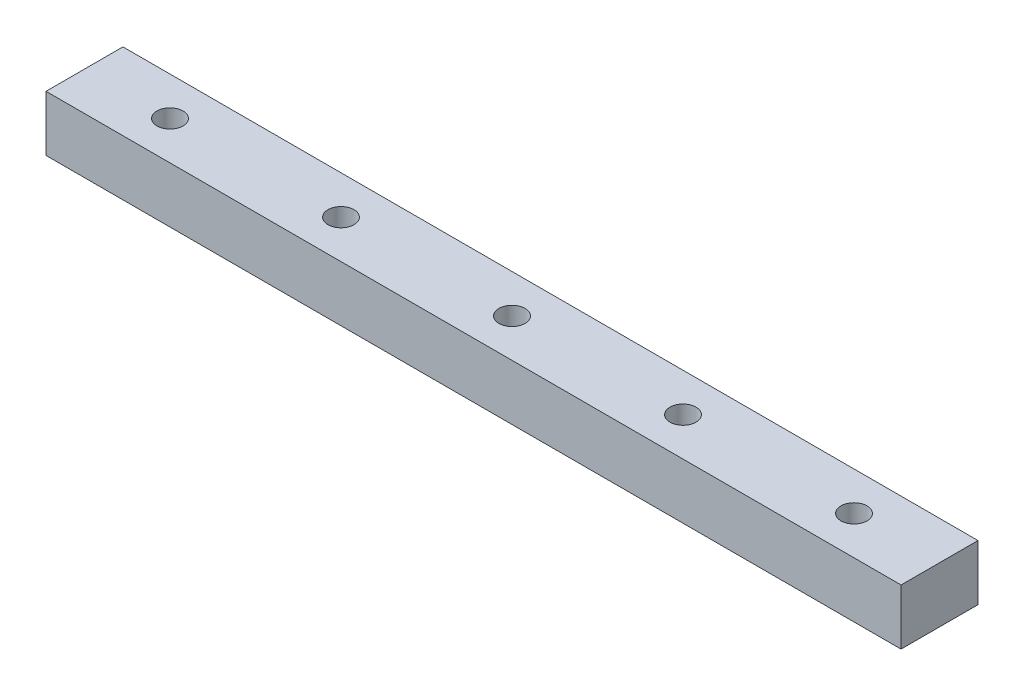
ISO-10303-21;
HEADER;
FILE_DESCRIPTION(('STEP AP214'),'2;1');
FILE_NAME('part.step','',(''),(''),'','','');
FILE_SCHEMA(('AUTOMOTIVE_DESIGN { 1 0 10303 214 1 1 1 1 }'));
ENDSEC;
DATA;
#1=APPLICATION_CONTEXT('core data for automotive mechanical design processes');
#2=APPLICATION_PROTOCOL_DEFINITION('international standard','automotive_design',2000,#1);
#3=PRODUCT_CONTEXT('',#1,'mechanical');
#4=PRODUCT('Part','Part','',(#3));
#5=PRODUCT_RELATED_PRODUCT_CATEGORY('part','',(#4));
#6=PRODUCT_DEFINITION_FORMATION('','',#4);
#7=PRODUCT_DEFINITION_CONTEXT('part definition',#1,'design');
#8=PRODUCT_DEFINITION('design','',#6,#7);
#9=PRODUCT_DEFINITION_SHAPE('','',#8);
#10=(LENGTH_UNIT() NAMED_UNIT(*) SI_UNIT(.MILLI.,.METRE.));
#11=(NAMED_UNIT(*) PLANE_ANGLE_UNIT() SI_UNIT($,.RADIAN.));
#12=(NAMED_UNIT(*) SI_UNIT($,.STERADIAN.) SOLID_ANGLE_UNIT());
#13=UNCERTAINTY_MEASURE_WITH_UNIT(LENGTH_MEASURE(1.E-05),#10,'distance_accuracy_value','');
#14=(GEOMETRIC_REPRESENTATION_CONTEXT(3) GLOBAL_UNCERTAINTY_ASSIGNED_CONTEXT((#13)) GLOBAL_UNIT_ASSIGNED_CONTEXT((#10,
#11,#12)) REPRESENTATION_CONTEXT('',''));
#15=CARTESIAN_POINT('',(0.,0.,0.));
#16=DIRECTION('',(0.,0.,1.));
#17=DIRECTION('',(1.,0.,0.));
#18=AXIS2_PLACEMENT_3D('',#15,#16,#17);
#19=CARTESIAN_POINT('',(100.,0.,0.));
#20=DIRECTION('',(0.,0.,-1.));
#21=DIRECTION('',(-1.,0.,0.));
#22=AXIS2_PLACEMENT_3D('',#19,#20,#21);
#23=PLANE('',#22);
#24=DIRECTION('',(0.,-1.,0.));
#25=VECTOR('',#24,1.);
#26=CARTESIAN_POINT('',(0.,0.,0.));
#27=LINE('',#26,#25);
#28=CARTESIAN_POINT('',(0.,6.5,0.));
#29=VERTEX_POINT('',#28);
#30=CARTESIAN_POINT('',(0.,0.,0.));
#31=VERTEX_POINT('',#30);
#32=EDGE_CURVE('E105',#29,#31,#27,.T.);
#33=ORIENTED_EDGE('',*,*,#32,.T.);
#34=DIRECTION('',(-1.,0.,0.));
#35=VECTOR('',#34,1.);
#36=CARTESIAN_POINT('',(100.,0.,0.));
#37=LINE('',#36,#35);
#38=CARTESIAN_POINT('',(100.,0.,0.));
#39=VERTEX_POINT('',#38);
#40=EDGE_CURVE('E11',#39,#31,#37,.T.);
#41=ORIENTED_EDGE('',*,*,#40,.F.);
#42=DIRECTION('',(0.,-1.,0.));
#43=VECTOR('',#42,1.);
#44=CARTESIAN_POINT('',(100.,0.,0.));
#45=LINE('',#44,#43);
#46=CARTESIAN_POINT('',(100.,6.5,0.));
#47=VERTEX_POINT('',#46);
#48=EDGE_CURVE('E89',#47,#39,#45,.T.);
#49=ORIENTED_EDGE('',*,*,#48,.F.);
#50=DIRECTION('',(-1.,0.,0.));
#51=VECTOR('',#50,1.);
#52=CARTESIAN_POINT('',(100.,6.5,0.));
#53=LINE('',#52,#51);
#54=EDGE_CURVE('E98',#47,#29,#53,.T.);
#55=ORIENTED_EDGE('',*,*,#54,.T.);
#56=EDGE_LOOP('',(#33,#41,#49,#55));
#57=FACE_BOUND('',#56,.T.);
#58=ADVANCED_FACE('F39',(#57),#23,.F.);
#59=CARTESIAN_POINT('',(100.,0.,0.));
#60=DIRECTION('',(0.,1.,0.));
#61=DIRECTION('',(0.,0.,1.));
#62=AXIS2_PLACEMENT_3D('',#59,#60,#61);
#63=PLANE('',#62);
#64=CARTESIAN_POINT('',(10.,0.,-4.5));
#65=DIRECTION('',(0.,1.,0.));
#66=DIRECTION('',(0.,0.,1.));
#67=AXIS2_PLACEMENT_3D('',#64,#65,#66);
#68=CIRCLE('',#67,1.525);
#69=CARTESIAN_POINT('',(10.,0.,-2.975));
#70=VERTEX_POINT('',#69);
#71=EDGE_CURVE('E104',#70,#70,#68,.T.);
#72=ORIENTED_EDGE('',*,*,#71,.T.);
#73=EDGE_LOOP('',(#72));
#74=FACE_BOUND('',#73,.T.);
#75=CARTESIAN_POINT('',(30.,0.,-4.5));
#76=DIRECTION('',(0.,1.,0.));
#77=DIRECTION('',(0.,0.,1.));
#78=AXIS2_PLACEMENT_3D('',#75,#76,#77);
#79=CIRCLE('',#78,1.525);
#80=CARTESIAN_POINT('',(30.,0.,-2.975));
#81=VERTEX_POINT('',#80);
#82=EDGE_CURVE('E140',#81,#81,#79,.T.);
#83=ORIENTED_EDGE('',*,*,#82,.T.);
#84=EDGE_LOOP('',(#83));
#85=FACE_BOUND('',#84,.T.);
#86=CARTESIAN_POINT('',(50.,0.,-4.5));
#87=DIRECTION('',(0.,1.,0.));
#88=DIRECTION('',(0.,0.,1.));
#89=AXIS2_PLACEMENT_3D('',#86,#87,#88);
#90=CIRCLE('',#89,1.525);
#91=CARTESIAN_POINT('',(50.,0.,-2.975));
#92=VERTEX_POINT('',#91);
#93=EDGE_CURVE('E133',#92,#92,#90,.T.);
#94=ORIENTED_EDGE('',*,*,#93,.T.);
#95=EDGE_LOOP('',(#94));
#96=FACE_BOUND('',#95,.T.);
#97=CARTESIAN_POINT('',(70.,0.,-4.5));
#98=DIRECTION('',(0.,1.,0.));
#99=DIRECTION('',(0.,0.,1.));
#100=AXIS2_PLACEMENT_3D('',#97,#98,#99);
#101=CIRCLE('',#100,1.52500000000001);
#102=CARTESIAN_POINT('',(70.,0.,-2.97499999999999));
#103=VERTEX_POINT('',#102);
#104=EDGE_CURVE('E124',#103,#103,#101,.T.);
#105=ORIENTED_EDGE('',*,*,#104,.T.);
#106=EDGE_LOOP('',(#105));
#107=FACE_BOUND('',#106,.T.);
#108=CARTESIAN_POINT('',(90.,0.,-4.5));
#109=DIRECTION('',(0.,1.,0.));
#110=DIRECTION('',(0.,0.,1.));
#111=AXIS2_PLACEMENT_3D('',#108,#109,#110);
#112=CIRCLE('',#111,1.52500000000001);
#113=CARTESIAN_POINT('',(90.,0.,-2.97499999999999));
#114=VERTEX_POINT('',#113);
#115=EDGE_CURVE('E120',#114,#114,#112,.T.);
#116=ORIENTED_EDGE('',*,*,#115,.T.);
#117=EDGE_LOOP('',(#116));
#118=FACE_BOUND('',#117,.T.);
#119=DIRECTION('',(0.,0.,-1.));
#120=VECTOR('',#119,1.);
#121=CARTESIAN_POINT('',(0.,0.,0.));
#122=LINE('',#121,#120);
#123=CARTESIAN_POINT('',(0.,0.,-9.));
#124=VERTEX_POINT('',#123);
#125=EDGE_CURVE('E94',#31,#124,#122,.T.);
#126=ORIENTED_EDGE('',*,*,#125,.T.);
#127=DIRECTION('',(-1.,0.,0.));
#128=VECTOR('',#127,1.);
#129=CARTESIAN_POINT('',(100.,0.,-9.));
#130=LINE('',#129,#128);
#131=CARTESIAN_POINT('',(100.,0.,-9.));
#132=VERTEX_POINT('',#131);
#133=EDGE_CURVE('E50',#132,#124,#130,.T.);
#134=ORIENTED_EDGE('',*,*,#133,.F.);
#135=DIRECTION('',(0.,0.,-1.));
#136=VECTOR('',#135,1.);
#137=CARTESIAN_POINT('',(100.,0.,0.));
#138=LINE('',#137,#136);
#139=EDGE_CURVE('E84',#39,#132,#138,.T.);
#140=ORIENTED_EDGE('',*,*,#139,.F.);
#141=ORIENTED_EDGE('',*,*,#40,.T.);
#142=EDGE_LOOP('',(#126,#134,#140,#141));
#143=FACE_BOUND('',#142,.T.);
#144=ADVANCED_FACE('F91',(#74,#85,#96,#107,#118,#143),#63,.F.);
#145=CARTESIAN_POINT('',(100.,0.,-9.));
#146=DIRECTION('',(0.,0.,1.));
#147=DIRECTION('',(1.,0.,0.));
#148=AXIS2_PLACEMENT_3D('',#145,#146,#147);
#149=PLANE('',#148);
#150=DIRECTION('',(0.,1.,0.));
#151=VECTOR('',#150,1.);
#152=CARTESIAN_POINT('',(0.,0.,-9.));
#153=LINE('',#152,#151);
#154=CARTESIAN_POINT('',(0.,6.5,-9.));
#155=VERTEX_POINT('',#154);
#156=EDGE_CURVE('E75',#124,#155,#153,.T.);
#157=ORIENTED_EDGE('',*,*,#156,.T.);
#158=DIRECTION('',(-1.,0.,0.));
#159=VECTOR('',#158,1.);
#160=CARTESIAN_POINT('',(100.,6.5,-9.));
#161=LINE('',#160,#159);
#162=CARTESIAN_POINT('',(100.,6.5,-9.));
#163=VERTEX_POINT('',#162);
#164=EDGE_CURVE('E92',#163,#155,#161,.T.);
#165=ORIENTED_EDGE('',*,*,#164,.F.);
#166=DIRECTION('',(0.,1.,0.));
#167=VECTOR('',#166,1.);
#168=CARTESIAN_POINT('',(100.,0.,-9.));
#169=LINE('',#168,#167);
#170=EDGE_CURVE('E86',#132,#163,#169,.T.);
#171=ORIENTED_EDGE('',*,*,#170,.F.);
#172=ORIENTED_EDGE('',*,*,#133,.T.);
#173=EDGE_LOOP('',(#157,#165,#171,#172));
#174=FACE_BOUND('',#173,.T.);
#175=ADVANCED_FACE('F96',(#174),#149,.F.);
#176=CARTESIAN_POINT('',(100.,6.5,0.));
#177=DIRECTION('',(0.,-1.,0.));
#178=DIRECTION('',(0.,0.,-1.));
#179=AXIS2_PLACEMENT_3D('',#176,#177,#178);
#180=PLANE('',#179);
#181=CARTESIAN_POINT('',(10.,6.5,-4.5));
#182=DIRECTION('',(0.,1.,0.));
#183=DIRECTION('',(0.,0.,1.));
#184=AXIS2_PLACEMENT_3D('',#181,#182,#183);
#185=CIRCLE('',#184,1.525);
#186=CARTESIAN_POINT('',(10.,6.5,-2.975));
#187=VERTEX_POINT('',#186);
#188=EDGE_CURVE('E139',#187,#187,#185,.T.);
#189=ORIENTED_EDGE('',*,*,#188,.F.);
#190=EDGE_LOOP('',(#189));
#191=FACE_BOUND('',#190,.T.);
#192=CARTESIAN_POINT('',(30.,6.5,-4.5));
#193=DIRECTION('',(0.,1.,0.));
#194=DIRECTION('',(0.,0.,1.));
#195=AXIS2_PLACEMENT_3D('',#192,#193,#194);
#196=CIRCLE('',#195,1.525);
#197=CARTESIAN_POINT('',(30.,6.5,-2.975));
#198=VERTEX_POINT('',#197);
#199=EDGE_CURVE('E135',#198,#198,#196,.T.);
#200=ORIENTED_EDGE('',*,*,#199,.F.);
#201=EDGE_LOOP('',(#200));
#202=FACE_BOUND('',#201,.T.);
#203=CARTESIAN_POINT('',(50.,6.5,-4.5));
#204=DIRECTION('',(0.,1.,0.));
#205=DIRECTION('',(0.,0.,1.));
#206=AXIS2_PLACEMENT_3D('',#203,#204,#205);
#207=CIRCLE('',#206,1.525);
#208=CARTESIAN_POINT('',(50.,6.5,-2.975));
#209=VERTEX_POINT('',#208);
#210=EDGE_CURVE('E126',#209,#209,#207,.T.);
#211=ORIENTED_EDGE('',*,*,#210,.F.);
#212=EDGE_LOOP('',(#211));
#213=FACE_BOUND('',#212,.T.);
#214=CARTESIAN_POINT('',(70.,6.5,-4.5));
#215=DIRECTION('',(0.,1.,0.));
#216=DIRECTION('',(0.,0.,1.));
#217=AXIS2_PLACEMENT_3D('',#214,#215,#216);
#218=CIRCLE('',#217,1.52500000000001);
#219=CARTESIAN_POINT('',(70.,6.5,-2.97499999999999));
#220=VERTEX_POINT('',#219);
#221=EDGE_CURVE('E125',#220,#220,#218,.T.);
#222=ORIENTED_EDGE('',*,*,#221,.F.);
#223=EDGE_LOOP('',(#222));
#224=FACE_BOUND('',#223,.T.);
#225=CARTESIAN_POINT('',(90.,6.5,-4.5));
#226=DIRECTION('',(0.,1.,0.));
#227=DIRECTION('',(0.,0.,1.));
#228=AXIS2_PLACEMENT_3D('',#225,#226,#227);
#229=CIRCLE('',#228,1.52500000000001);
#230=CARTESIAN_POINT('',(90.,6.5,-2.97499999999999));
#231=VERTEX_POINT('',#230);
#232=EDGE_CURVE('E118',#231,#231,#229,.T.);
#233=ORIENTED_EDGE('',*,*,#232,.F.);
#234=EDGE_LOOP('',(#233));
#235=FACE_BOUND('',#234,.T.);
#236=DIRECTION('',(0.,0.,1.));
#237=VECTOR('',#236,1.);
#238=CARTESIAN_POINT('',(0.,6.5,0.));
#239=LINE('',#238,#237);
#240=EDGE_CURVE('E77',#155,#29,#239,.T.);
#241=ORIENTED_EDGE('',*,*,#240,.T.);
#242=ORIENTED_EDGE('',*,*,#54,.F.);
#243=DIRECTION('',(0.,0.,1.));
#244=VECTOR('',#243,1.);
#245=CARTESIAN_POINT('',(100.,6.5,0.));
#246=LINE('',#245,#244);
#247=EDGE_CURVE('E54',#163,#47,#246,.T.);
#248=ORIENTED_EDGE('',*,*,#247,.F.);
#249=ORIENTED_EDGE('',*,*,#164,.T.);
#250=EDGE_LOOP('',(#241,#242,#248,#249));
#251=FACE_BOUND('',#250,.T.);
#252=ADVANCED_FACE('F109',(#191,#202,#213,#224,#235,#251),#180,.F.);
#253=CARTESIAN_POINT('',(100.,0.,0.));
#254=DIRECTION('',(-1.,0.,0.));
#255=DIRECTION('',(0.,0.,1.));
#256=AXIS2_PLACEMENT_3D('',#253,#254,#255);
#257=PLANE('',#256);
#258=ORIENTED_EDGE('',*,*,#48,.T.);
#259=ORIENTED_EDGE('',*,*,#139,.T.);
#260=ORIENTED_EDGE('',*,*,#170,.T.);
#261=ORIENTED_EDGE('',*,*,#247,.T.);
#262=EDGE_LOOP('',(#258,#259,#260,#261));
#263=FACE_BOUND('',#262,.T.);
#264=ADVANCED_FACE('F88',(#263),#257,.F.);
#265=CARTESIAN_POINT('',(0.,0.,0.));
#266=DIRECTION('',(-1.,0.,0.));
#267=DIRECTION('',(0.,0.,1.));
#268=AXIS2_PLACEMENT_3D('',#265,#266,#267);
#269=PLANE('',#268);
#270=ORIENTED_EDGE('',*,*,#32,.F.);
#271=ORIENTED_EDGE('',*,*,#240,.F.);
#272=ORIENTED_EDGE('',*,*,#156,.F.);
#273=ORIENTED_EDGE('',*,*,#125,.F.);
#274=EDGE_LOOP('',(#270,#271,#272,#273));
#275=FACE_BOUND('',#274,.T.);
#276=ADVANCED_FACE('F114',(#275),#269,.T.);
#277=CARTESIAN_POINT('',(90.,0.,-4.5));
#278=DIRECTION('',(0.,1.,0.));
#279=DIRECTION('',(0.,0.,1.));
#280=AXIS2_PLACEMENT_3D('',#277,#278,#279);
#281=CYLINDRICAL_SURFACE('',#280,1.52500000000001);
#282=CARTESIAN_POINT('',(90.,0.,-2.97499999999999));
#283=CARTESIAN_POINT('',(90.,0.0677083333333332,-2.97499999999999));
#284=CARTESIAN_POINT('',(90.,0.135416666666667,-2.97499999999999));
#285=CARTESIAN_POINT('',(90.,0.270833333333333,-2.97499999999999));
#286=CARTESIAN_POINT('',(90.,0.338541666666667,-2.97499999999999));
#287=CARTESIAN_POINT('',(90.,0.473958333333333,-2.97499999999999));
#288=CARTESIAN_POINT('',(90.,0.541666666666667,-2.97499999999999));
#289=CARTESIAN_POINT('',(90.,0.677083333333333,-2.97499999999999));
#290=CARTESIAN_POINT('',(90.,0.744791666666667,-2.97499999999999));
#291=CARTESIAN_POINT('',(90.,0.880208333333333,-2.97499999999999));
#292=CARTESIAN_POINT('',(90.,0.947916666666667,-2.97499999999999));
#293=CARTESIAN_POINT('',(90.,1.08333333333333,-2.97499999999999));
#294=CARTESIAN_POINT('',(90.,1.15104166666667,-2.97499999999999));
#295=CARTESIAN_POINT('',(90.,1.28645833333333,-2.97499999999999));
#296=CARTESIAN_POINT('',(90.,1.35416666666667,-2.97499999999999));
#297=CARTESIAN_POINT('',(90.,1.48958333333333,-2.97499999999999));
#298=CARTESIAN_POINT('',(90.,1.55729166666667,-2.97499999999999));
#299=CARTESIAN_POINT('',(90.,1.69270833333333,-2.97499999999999));
#300=CARTESIAN_POINT('',(90.,1.76041666666667,-2.97499999999999));
#301=CARTESIAN_POINT('',(90.,1.89583333333333,-2.97499999999999));
#302=CARTESIAN_POINT('',(90.,1.96354166666667,-2.97499999999999));
#303=CARTESIAN_POINT('',(90.,2.09895833333333,-2.97499999999999));
#304=CARTESIAN_POINT('',(90.,2.16666666666667,-2.97499999999999));
#305=CARTESIAN_POINT('',(90.,2.30208333333333,-2.97499999999999));
#306=CARTESIAN_POINT('',(90.,2.36979166666667,-2.97499999999999));
#307=CARTESIAN_POINT('',(90.,2.50520833333333,-2.97499999999999));
#308=CARTESIAN_POINT('',(90.,2.57291666666667,-2.97499999999999));
#309=CARTESIAN_POINT('',(90.,2.70833333333333,-2.97499999999999));
#310=CARTESIAN_POINT('',(90.,2.77604166666667,-2.97499999999999));
#311=CARTESIAN_POINT('',(90.,2.91145833333333,-2.97499999999999));
#312=CARTESIAN_POINT('',(90.,2.97916666666667,-2.97499999999999));
#313=CARTESIAN_POINT('',(90.,3.11458333333333,-2.97499999999999));
#314=CARTESIAN_POINT('',(90.,3.18229166666667,-2.97499999999999));
#315=CARTESIAN_POINT('',(90.,3.31770833333333,-2.97499999999999));
#316=CARTESIAN_POINT('',(90.,3.38541666666667,-2.97499999999999));
#317=CARTESIAN_POINT('',(90.,3.52083333333333,-2.97499999999999));
#318=CARTESIAN_POINT('',(90.,3.58854166666667,-2.97499999999999));
#319=CARTESIAN_POINT('',(90.,3.72395833333333,-2.97499999999999));
#320=CARTESIAN_POINT('',(90.,3.79166666666667,-2.97499999999999));
#321=CARTESIAN_POINT('',(90.,3.92708333333333,-2.97499999999999));
#322=CARTESIAN_POINT('',(90.,3.99479166666667,-2.97499999999999));
#323=CARTESIAN_POINT('',(90.,4.13020833333333,-2.97499999999999));
#324=CARTESIAN_POINT('',(90.,4.19791666666667,-2.97499999999999));
#325=CARTESIAN_POINT('',(90.,4.33333333333333,-2.97499999999999));
#326=CARTESIAN_POINT('',(90.,4.40104166666667,-2.97499999999999));
#327=CARTESIAN_POINT('',(90.,4.53645833333333,-2.97499999999999));
#328=CARTESIAN_POINT('',(90.,4.60416666666667,-2.97499999999999));
#329=CARTESIAN_POINT('',(90.,4.73958333333333,-2.97499999999999));
#330=CARTESIAN_POINT('',(90.,4.80729166666667,-2.97499999999999));
#331=CARTESIAN_POINT('',(90.,4.94270833333333,-2.97499999999999));
#332=CARTESIAN_POINT('',(90.,5.01041666666667,-2.97499999999999));
#333=CARTESIAN_POINT('',(90.,5.14583333333333,-2.97499999999999));
#334=CARTESIAN_POINT('',(90.,5.21354166666667,-2.97499999999999));
#335=CARTESIAN_POINT('',(90.,5.34895833333333,-2.97499999999999));
#336=CARTESIAN_POINT('',(90.,5.41666666666667,-2.97499999999999));
#337=CARTESIAN_POINT('',(90.,5.55208333333333,-2.97499999999999));
#338=CARTESIAN_POINT('',(90.,5.61979166666667,-2.97499999999999));
#339=CARTESIAN_POINT('',(90.,5.75520833333333,-2.97499999999999));
#340=CARTESIAN_POINT('',(90.,5.82291666666667,-2.97499999999999));
#341=CARTESIAN_POINT('',(90.,5.95833333333333,-2.97499999999999));
#342=CARTESIAN_POINT('',(90.,6.02604166666667,-2.97499999999999));
#343=CARTESIAN_POINT('',(90.,6.16145833333333,-2.97499999999999));
#344=CARTESIAN_POINT('',(90.,6.22916666666667,-2.97499999999999));
#345=CARTESIAN_POINT('',(90.,6.36458333333333,-2.97499999999999));
#346=CARTESIAN_POINT('',(90.,6.43229166666667,-2.97499999999999));
#347=CARTESIAN_POINT('',(90.,6.5,-2.97499999999999));
#348=B_SPLINE_CURVE_WITH_KNOTS('',3,(#282,#283,#284,#285,#286,#287,#288,#289,#290,#291,#292,
#293,#294,#295,#296,#297,#298,#299,#300,#301,#302,#303,#304,#305,#306,#307,#308,#309,#310,#311,
#312,#313,#314,#315,#316,#317,#318,#319,#320,#321,#322,#323,#324,#325,#326,#327,#328,#329,#330,
#331,#332,#333,#334,#335,#336,#337,#338,#339,#340,#341,#342,#343,#344,#345,#346,#347),
.UNSPECIFIED.,.F.,.F.,(4,2,2,2,2,2,2,2,2,2,2,2,2,2,2,2,2,2,2,2,2,2,2,2,2,2,2,2,2,2,2,2,4),(0.,
0.203125,0.40625,0.609375,0.8125,1.015625,1.21875,1.421875,1.625,1.828125,2.03125,2.234375,
2.4375,2.640625,2.84375,3.046875,3.25,3.453125,3.65625,3.859375,4.0625,4.265625,4.46875,
4.671875,4.875,5.078125,5.28125,5.484375,5.6875,5.890625,6.09375,6.296875,6.5),.UNSPECIFIED.);
#349=EDGE_CURVE('BSEAM167',#114,#231,#348,.T.);
#350=ORIENTED_EDGE('',*,*,#115,.F.);
#351=ORIENTED_EDGE('',*,*,#232,.T.);
#352=ORIENTED_EDGE('',*,*,#349,.T.);
#353=ORIENTED_EDGE('',*,*,#349,.F.);
#354=EDGE_LOOP('',(#350,#352,#351,#353));
#355=FACE_BOUND('',#354,.T.);
#356=ADVANCED_FACE('F167',(#355),#281,.F.);
#357=CARTESIAN_POINT('',(70.,0.,-4.5));
#358=DIRECTION('',(0.,1.,0.));
#359=DIRECTION('',(0.,0.,1.));
#360=AXIS2_PLACEMENT_3D('',#357,#358,#359);
#361=CYLINDRICAL_SURFACE('',#360,1.52500000000001);
#362=CARTESIAN_POINT('',(70.,0.,-2.97499999999999));
#363=CARTESIAN_POINT('',(70.,0.0677083333333332,-2.97499999999999));
#364=CARTESIAN_POINT('',(70.,0.135416666666667,-2.97499999999999));
#365=CARTESIAN_POINT('',(70.,0.270833333333333,-2.97499999999999));
#366=CARTESIAN_POINT('',(70.,0.338541666666667,-2.97499999999999));
#367=CARTESIAN_POINT('',(70.,0.473958333333333,-2.97499999999999));
#368=CARTESIAN_POINT('',(70.,0.541666666666667,-2.97499999999999));
#369=CARTESIAN_POINT('',(70.,0.677083333333333,-2.97499999999999));
#370=CARTESIAN_POINT('',(70.,0.744791666666667,-2.97499999999999));
#371=CARTESIAN_POINT('',(70.,0.880208333333333,-2.97499999999999));
#372=CARTESIAN_POINT('',(70.,0.947916666666667,-2.97499999999999));
#373=CARTESIAN_POINT('',(70.,1.08333333333333,-2.97499999999999));
#374=CARTESIAN_POINT('',(70.,1.15104166666667,-2.97499999999999));
#375=CARTESIAN_POINT('',(70.,1.28645833333333,-2.97499999999999));
#376=CARTESIAN_POINT('',(70.,1.35416666666667,-2.97499999999999));
#377=CARTESIAN_POINT('',(70.,1.48958333333333,-2.97499999999999));
#378=CARTESIAN_POINT('',(70.,1.55729166666667,-2.97499999999999));
#379=CARTESIAN_POINT('',(70.,1.69270833333333,-2.97499999999999));
#380=CARTESIAN_POINT('',(70.,1.76041666666667,-2.97499999999999));
#381=CARTESIAN_POINT('',(70.,1.89583333333333,-2.97499999999999));
#382=CARTESIAN_POINT('',(70.,1.96354166666667,-2.97499999999999));
#383=CARTESIAN_POINT('',(70.,2.09895833333333,-2.97499999999999));
#384=CARTESIAN_POINT('',(70.,2.16666666666667,-2.97499999999999));
#385=CARTESIAN_POINT('',(70.,2.30208333333333,-2.97499999999999));
#386=CARTESIAN_POINT('',(70.,2.36979166666667,-2.97499999999999));
#387=CARTESIAN_POINT('',(70.,2.50520833333333,-2.97499999999999));
#388=CARTESIAN_POINT('',(70.,2.57291666666667,-2.97499999999999));
#389=CARTESIAN_POINT('',(70.,2.70833333333333,-2.97499999999999));
#390=CARTESIAN_POINT('',(70.,2.77604166666667,-2.97499999999999));
#391=CARTESIAN_POINT('',(70.,2.91145833333333,-2.97499999999999));
#392=CARTESIAN_POINT('',(70.,2.97916666666667,-2.97499999999999));
#393=CARTESIAN_POINT('',(70.,3.11458333333333,-2.97499999999999));
#394=CARTESIAN_POINT('',(70.,3.18229166666667,-2.97499999999999));
#395=CARTESIAN_POINT('',(70.,3.31770833333333,-2.97499999999999));
#396=CARTESIAN_POINT('',(70.,3.38541666666667,-2.97499999999999));
#397=CARTESIAN_POINT('',(70.,3.52083333333333,-2.97499999999999));
#398=CARTESIAN_POINT('',(70.,3.58854166666667,-2.97499999999999));
#399=CARTESIAN_POINT('',(70.,3.72395833333333,-2.97499999999999));
#400=CARTESIAN_POINT('',(70.,3.79166666666667,-2.97499999999999));
#401=CARTESIAN_POINT('',(70.,3.92708333333333,-2.97499999999999));
#402=CARTESIAN_POINT('',(70.,3.99479166666667,-2.97499999999999));
#403=CARTESIAN_POINT('',(70.,4.13020833333333,-2.97499999999999));
#404=CARTESIAN_POINT('',(70.,4.19791666666667,-2.97499999999999));
#405=CARTESIAN_POINT('',(70.,4.33333333333333,-2.97499999999999));
#406=CARTESIAN_POINT('',(70.,4.40104166666667,-2.97499999999999));
#407=CARTESIAN_POINT('',(70.,4.53645833333333,-2.97499999999999));
#408=CARTESIAN_POINT('',(70.,4.60416666666667,-2.97499999999999));
#409=CARTESIAN_POINT('',(70.,4.73958333333333,-2.97499999999999));
#410=CARTESIAN_POINT('',(70.,4.80729166666667,-2.97499999999999));
#411=CARTESIAN_POINT('',(70.,4.94270833333333,-2.97499999999999));
#412=CARTESIAN_POINT('',(70.,5.01041666666667,-2.97499999999999));
#413=CARTESIAN_POINT('',(70.,5.14583333333333,-2.97499999999999));
#414=CARTESIAN_POINT('',(70.,5.21354166666667,-2.97499999999999));
#415=CARTESIAN_POINT('',(70.,5.34895833333333,-2.97499999999999));
#416=CARTESIAN_POINT('',(70.,5.41666666666667,-2.97499999999999));
#417=CARTESIAN_POINT('',(70.,5.55208333333333,-2.97499999999999));
#418=CARTESIAN_POINT('',(70.,5.61979166666667,-2.97499999999999));
#419=CARTESIAN_POINT('',(70.,5.75520833333333,-2.97499999999999));
#420=CARTESIAN_POINT('',(70.,5.82291666666667,-2.97499999999999));
#421=CARTESIAN_POINT('',(70.,5.95833333333333,-2.97499999999999));
#422=CARTESIAN_POINT('',(70.,6.02604166666667,-2.97499999999999));
#423=CARTESIAN_POINT('',(70.,6.16145833333333,-2.97499999999999));
#424=CARTESIAN_POINT('',(70.,6.22916666666667,-2.97499999999999));
#425=CARTESIAN_POINT('',(70.,6.36458333333333,-2.97499999999999));
#426=CARTESIAN_POINT('',(70.,6.43229166666667,-2.97499999999999));
#427=CARTESIAN_POINT('',(70.,6.5,-2.97499999999999));
#428=B_SPLINE_CURVE_WITH_KNOTS('',3,(#362,#363,#364,#365,#366,#367,#368,#369,#370,#371,#372,
#373,#374,#375,#376,#377,#378,#379,#380,#381,#382,#383,#384,#385,#386,#387,#388,#389,#390,#391,
#392,#393,#394,#395,#396,#397,#398,#399,#400,#401,#402,#403,#404,#405,#406,#407,#408,#409,#410,
#411,#412,#413,#414,#415,#416,#417,#418,#419,#420,#421,#422,#423,#424,#425,#426,#427),
.UNSPECIFIED.,.F.,.F.,(4,2,2,2,2,2,2,2,2,2,2,2,2,2,2,2,2,2,2,2,2,2,2,2,2,2,2,2,2,2,2,2,4),(0.,
0.203125,0.40625,0.609375,0.8125,1.015625,1.21875,1.421875,1.625,1.828125,2.03125,2.234375,
2.4375,2.640625,2.84375,3.046875,3.25,3.453125,3.65625,3.859375,4.0625,4.265625,4.46875,
4.671875,4.875,5.078125,5.28125,5.484375,5.6875,5.890625,6.09375,6.296875,6.5),.UNSPECIFIED.);
#429=EDGE_CURVE('BSEAM169',#103,#220,#428,.T.);
#430=ORIENTED_EDGE('',*,*,#104,.F.);
#431=ORIENTED_EDGE('',*,*,#221,.T.);
#432=ORIENTED_EDGE('',*,*,#429,.T.);
#433=ORIENTED_EDGE('',*,*,#429,.F.);
#434=EDGE_LOOP('',(#430,#432,#431,#433));
#435=FACE_BOUND('',#434,.T.);
#436=ADVANCED_FACE('F169',(#435),#361,.F.);
#437=CARTESIAN_POINT('',(50.,0.,-4.5));
#438=DIRECTION('',(0.,1.,0.));
#439=DIRECTION('',(0.,0.,1.));
#440=AXIS2_PLACEMENT_3D('',#437,#438,#439);
#441=CYLINDRICAL_SURFACE('',#440,1.525);
#442=CARTESIAN_POINT('',(50.,0.,-2.975));
#443=CARTESIAN_POINT('',(50.,0.0677083333333332,-2.975));
#444=CARTESIAN_POINT('',(50.,0.135416666666667,-2.975));
#445=CARTESIAN_POINT('',(50.,0.270833333333333,-2.975));
#446=CARTESIAN_POINT('',(50.,0.338541666666667,-2.975));
#447=CARTESIAN_POINT('',(50.,0.473958333333333,-2.975));
#448=CARTESIAN_POINT('',(50.,0.541666666666667,-2.975));
#449=CARTESIAN_POINT('',(50.,0.677083333333333,-2.975));
#450=CARTESIAN_POINT('',(50.,0.744791666666667,-2.975));
#451=CARTESIAN_POINT('',(50.,0.880208333333333,-2.975));
#452=CARTESIAN_POINT('',(50.,0.947916666666667,-2.975));
#453=CARTESIAN_POINT('',(50.,1.08333333333333,-2.975));
#454=CARTESIAN_POINT('',(50.,1.15104166666667,-2.975));
#455=CARTESIAN_POINT('',(50.,1.28645833333333,-2.975));
#456=CARTESIAN_POINT('',(50.,1.35416666666667,-2.975));
#457=CARTESIAN_POINT('',(50.,1.48958333333333,-2.975));
#458=CARTESIAN_POINT('',(50.,1.55729166666667,-2.975));
#459=CARTESIAN_POINT('',(50.,1.69270833333333,-2.975));
#460=CARTESIAN_POINT('',(50.,1.76041666666667,-2.975));
#461=CARTESIAN_POINT('',(50.,1.89583333333333,-2.975));
#462=CARTESIAN_POINT('',(50.,1.96354166666667,-2.975));
#463=CARTESIAN_POINT('',(50.,2.09895833333333,-2.975));
#464=CARTESIAN_POINT('',(50.,2.16666666666667,-2.975));
#465=CARTESIAN_POINT('',(50.,2.30208333333333,-2.975));
#466=CARTESIAN_POINT('',(50.,2.36979166666667,-2.975));
#467=CARTESIAN_POINT('',(50.,2.50520833333333,-2.975));
#468=CARTESIAN_POINT('',(50.,2.57291666666667,-2.975));
#469=CARTESIAN_POINT('',(50.,2.70833333333333,-2.975));
#470=CARTESIAN_POINT('',(50.,2.77604166666667,-2.975));
#471=CARTESIAN_POINT('',(50.,2.91145833333333,-2.975));
#472=CARTESIAN_POINT('',(50.,2.97916666666667,-2.975));
#473=CARTESIAN_POINT('',(50.,3.11458333333333,-2.975));
#474=CARTESIAN_POINT('',(50.,3.18229166666667,-2.975));
#475=CARTESIAN_POINT('',(50.,3.31770833333333,-2.975));
#476=CARTESIAN_POINT('',(50.,3.38541666666667,-2.975));
#477=CARTESIAN_POINT('',(50.,3.52083333333333,-2.975));
#478=CARTESIAN_POINT('',(50.,3.58854166666667,-2.975));
#479=CARTESIAN_POINT('',(50.,3.72395833333333,-2.975));
#480=CARTESIAN_POINT('',(50.,3.79166666666667,-2.975));
#481=CARTESIAN_POINT('',(50.,3.92708333333333,-2.975));
#482=CARTESIAN_POINT('',(50.,3.99479166666667,-2.975));
#483=CARTESIAN_POINT('',(50.,4.13020833333333,-2.975));
#484=CARTESIAN_POINT('',(50.,4.19791666666667,-2.975));
#485=CARTESIAN_POINT('',(50.,4.33333333333333,-2.975));
#486=CARTESIAN_POINT('',(50.,4.40104166666667,-2.975));
#487=CARTESIAN_POINT('',(50.,4.53645833333333,-2.975));
#488=CARTESIAN_POINT('',(50.,4.60416666666667,-2.975));
#489=CARTESIAN_POINT('',(50.,4.73958333333333,-2.975));
#490=CARTESIAN_POINT('',(50.,4.80729166666667,-2.975));
#491=CARTESIAN_POINT('',(50.,4.94270833333333,-2.975));
#492=CARTESIAN_POINT('',(50.,5.01041666666667,-2.975));
#493=CARTESIAN_POINT('',(50.,5.14583333333333,-2.975));
#494=CARTESIAN_POINT('',(50.,5.21354166666667,-2.975));
#495=CARTESIAN_POINT('',(50.,5.34895833333333,-2.975));
#496=CARTESIAN_POINT('',(50.,5.41666666666667,-2.975));
#497=CARTESIAN_POINT('',(50.,5.55208333333333,-2.975));
#498=CARTESIAN_POINT('',(50.,5.61979166666667,-2.975));
#499=CARTESIAN_POINT('',(50.,5.75520833333333,-2.975));
#500=CARTESIAN_POINT('',(50.,5.82291666666667,-2.975));
#501=CARTESIAN_POINT('',(50.,5.95833333333333,-2.975));
#502=CARTESIAN_POINT('',(50.,6.02604166666667,-2.975));
#503=CARTESIAN_POINT('',(50.,6.16145833333333,-2.975));
#504=CARTESIAN_POINT('',(50.,6.22916666666667,-2.975));
#505=CARTESIAN_POINT('',(50.,6.36458333333333,-2.975));
#506=CARTESIAN_POINT('',(50.,6.43229166666667,-2.975));
#507=CARTESIAN_POINT('',(50.,6.5,-2.975));
#508=B_SPLINE_CURVE_WITH_KNOTS('',3,(#442,#443,#444,#445,#446,#447,#448,#449,#450,#451,#452,
#453,#454,#455,#456,#457,#458,#459,#460,#461,#462,#463,#464,#465,#466,#467,#468,#469,#470,#471,
#472,#473,#474,#475,#476,#477,#478,#479,#480,#481,#482,#483,#484,#485,#486,#487,#488,#489,#490,
#491,#492,#493,#494,#495,#496,#497,#498,#499,#500,#501,#502,#503,#504,#505,#506,#507),
.UNSPECIFIED.,.F.,.F.,(4,2,2,2,2,2,2,2,2,2,2,2,2,2,2,2,2,2,2,2,2,2,2,2,2,2,2,2,2,2,2,2,4),(0.,
0.203125,0.40625,0.609375,0.8125,1.015625,1.21875,1.421875,1.625,1.828125,2.03125,2.234375,
2.4375,2.640625,2.84375,3.046875,3.25,3.453125,3.65625,3.859375,4.0625,4.265625,4.46875,
4.671875,4.875,5.078125,5.28125,5.484375,5.6875,5.890625,6.09375,6.296875,6.5),.UNSPECIFIED.);
#509=EDGE_CURVE('BSEAM175',#92,#209,#508,.T.);
#510=ORIENTED_EDGE('',*,*,#93,.F.);
#511=ORIENTED_EDGE('',*,*,#210,.T.);
#512=ORIENTED_EDGE('',*,*,#509,.T.);
#513=ORIENTED_EDGE('',*,*,#509,.F.);
#514=EDGE_LOOP('',(#510,#512,#511,#513));
#515=FACE_BOUND('',#514,.T.);
#516=ADVANCED_FACE('F175',(#515),#441,.F.);
#517=CARTESIAN_POINT('',(30.,0.,-4.5));
#518=DIRECTION('',(0.,1.,0.));
#519=DIRECTION('',(0.,0.,1.));
#520=AXIS2_PLACEMENT_3D('',#517,#518,#519);
#521=CYLINDRICAL_SURFACE('',#520,1.525);
#522=CARTESIAN_POINT('',(30.,0.,-2.975));
#523=CARTESIAN_POINT('',(30.,0.0677083333333332,-2.975));
#524=CARTESIAN_POINT('',(30.,0.135416666666667,-2.975));
#525=CARTESIAN_POINT('',(30.,0.270833333333333,-2.975));
#526=CARTESIAN_POINT('',(30.,0.338541666666667,-2.975));
#527=CARTESIAN_POINT('',(30.,0.473958333333333,-2.975));
#528=CARTESIAN_POINT('',(30.,0.541666666666667,-2.975));
#529=CARTESIAN_POINT('',(30.,0.677083333333333,-2.975));
#530=CARTESIAN_POINT('',(30.,0.744791666666667,-2.975));
#531=CARTESIAN_POINT('',(30.,0.880208333333333,-2.975));
#532=CARTESIAN_POINT('',(30.,0.947916666666667,-2.975));
#533=CARTESIAN_POINT('',(30.,1.08333333333333,-2.975));
#534=CARTESIAN_POINT('',(30.,1.15104166666667,-2.975));
#535=CARTESIAN_POINT('',(30.,1.28645833333333,-2.975));
#536=CARTESIAN_POINT('',(30.,1.35416666666667,-2.975));
#537=CARTESIAN_POINT('',(30.,1.48958333333333,-2.975));
#538=CARTESIAN_POINT('',(30.,1.55729166666667,-2.975));
#539=CARTESIAN_POINT('',(30.,1.69270833333333,-2.975));
#540=CARTESIAN_POINT('',(30.,1.76041666666667,-2.975));
#541=CARTESIAN_POINT('',(30.,1.89583333333333,-2.975));
#542=CARTESIAN_POINT('',(30.,1.96354166666667,-2.975));
#543=CARTESIAN_POINT('',(30.,2.09895833333333,-2.975));
#544=CARTESIAN_POINT('',(30.,2.16666666666667,-2.975));
#545=CARTESIAN_POINT('',(30.,2.30208333333333,-2.975));
#546=CARTESIAN_POINT('',(30.,2.36979166666667,-2.975));
#547=CARTESIAN_POINT('',(30.,2.50520833333333,-2.975));
#548=CARTESIAN_POINT('',(30.,2.57291666666667,-2.975));
#549=CARTESIAN_POINT('',(30.,2.70833333333333,-2.975));
#550=CARTESIAN_POINT('',(30.,2.77604166666667,-2.975));
#551=CARTESIAN_POINT('',(30.,2.91145833333333,-2.975));
#552=CARTESIAN_POINT('',(30.,2.97916666666667,-2.975));
#553=CARTESIAN_POINT('',(30.,3.11458333333333,-2.975));
#554=CARTESIAN_POINT('',(30.,3.18229166666667,-2.975));
#555=CARTESIAN_POINT('',(30.,3.31770833333333,-2.975));
#556=CARTESIAN_POINT('',(30.,3.38541666666667,-2.975));
#557=CARTESIAN_POINT('',(30.,3.52083333333333,-2.975));
#558=CARTESIAN_POINT('',(30.,3.58854166666667,-2.975));
#559=CARTESIAN_POINT('',(30.,3.72395833333333,-2.975));
#560=CARTESIAN_POINT('',(30.,3.79166666666667,-2.975));
#561=CARTESIAN_POINT('',(30.,3.92708333333333,-2.975));
#562=CARTESIAN_POINT('',(30.,3.99479166666667,-2.975));
#563=CARTESIAN_POINT('',(30.,4.13020833333333,-2.975));
#564=CARTESIAN_POINT('',(30.,4.19791666666667,-2.975));
#565=CARTESIAN_POINT('',(30.,4.33333333333333,-2.975));
#566=CARTESIAN_POINT('',(30.,4.40104166666667,-2.975));
#567=CARTESIAN_POINT('',(30.,4.53645833333333,-2.975));
#568=CARTESIAN_POINT('',(30.,4.60416666666667,-2.975));
#569=CARTESIAN_POINT('',(30.,4.73958333333333,-2.975));
#570=CARTESIAN_POINT('',(30.,4.80729166666667,-2.975));
#571=CARTESIAN_POINT('',(30.,4.94270833333333,-2.975));
#572=CARTESIAN_POINT('',(30.,5.01041666666667,-2.975));
#573=CARTESIAN_POINT('',(30.,5.14583333333333,-2.975));
#574=CARTESIAN_POINT('',(30.,5.21354166666667,-2.975));
#575=CARTESIAN_POINT('',(30.,5.34895833333333,-2.975));
#576=CARTESIAN_POINT('',(30.,5.41666666666667,-2.975));
#577=CARTESIAN_POINT('',(30.,5.55208333333333,-2.975));
#578=CARTESIAN_POINT('',(30.,5.61979166666667,-2.975));
#579=CARTESIAN_POINT('',(30.,5.75520833333333,-2.975));
#580=CARTESIAN_POINT('',(30.,5.82291666666667,-2.975));
#581=CARTESIAN_POINT('',(30.,5.95833333333333,-2.975));
#582=CARTESIAN_POINT('',(30.,6.02604166666667,-2.975));
#583=CARTESIAN_POINT('',(30.,6.16145833333333,-2.975));
#584=CARTESIAN_POINT('',(30.,6.22916666666667,-2.975));
#585=CARTESIAN_POINT('',(30.,6.36458333333333,-2.975));
#586=CARTESIAN_POINT('',(30.,6.43229166666667,-2.975));
#587=CARTESIAN_POINT('',(30.,6.5,-2.975));
#588=B_SPLINE_CURVE_WITH_KNOTS('',3,(#522,#523,#524,#525,#526,#527,#528,#529,#530,#531,#532,
#533,#534,#535,#536,#537,#538,#539,#540,#541,#542,#543,#544,#545,#546,#547,#548,#549,#550,#551,
#552,#553,#554,#555,#556,#557,#558,#559,#560,#561,#562,#563,#564,#565,#566,#567,#568,#569,#570,
#571,#572,#573,#574,#575,#576,#577,#578,#579,#580,#581,#582,#583,#584,#585,#586,#587),
.UNSPECIFIED.,.F.,.F.,(4,2,2,2,2,2,2,2,2,2,2,2,2,2,2,2,2,2,2,2,2,2,2,2,2,2,2,2,2,2,2,2,4),(0.,
0.203125,0.40625,0.609375,0.8125,1.015625,1.21875,1.421875,1.625,1.828125,2.03125,2.234375,
2.4375,2.640625,2.84375,3.046875,3.25,3.453125,3.65625,3.859375,4.0625,4.265625,4.46875,
4.671875,4.875,5.078125,5.28125,5.484375,5.6875,5.890625,6.09375,6.296875,6.5),.UNSPECIFIED.);
#589=EDGE_CURVE('BSEAM151',#81,#198,#588,.T.);
#590=ORIENTED_EDGE('',*,*,#82,.F.);
#591=ORIENTED_EDGE('',*,*,#199,.T.);
#592=ORIENTED_EDGE('',*,*,#589,.T.);
#593=ORIENTED_EDGE('',*,*,#589,.F.);
#594=EDGE_LOOP('',(#590,#592,#591,#593));
#595=FACE_BOUND('',#594,.T.);
#596=ADVANCED_FACE('F151',(#595),#521,.F.);
#597=CARTESIAN_POINT('',(10.,0.,-4.5));
#598=DIRECTION('',(0.,1.,0.));
#599=DIRECTION('',(0.,0.,1.));
#600=AXIS2_PLACEMENT_3D('',#597,#598,#599);
#601=CYLINDRICAL_SURFACE('',#600,1.525);
#602=CARTESIAN_POINT('',(10.,0.,-2.975));
#603=CARTESIAN_POINT('',(10.,0.0677083333333332,-2.975));
#604=CARTESIAN_POINT('',(10.,0.135416666666667,-2.975));
#605=CARTESIAN_POINT('',(10.,0.270833333333333,-2.975));
#606=CARTESIAN_POINT('',(10.,0.338541666666667,-2.975));
#607=CARTESIAN_POINT('',(10.,0.473958333333333,-2.975));
#608=CARTESIAN_POINT('',(10.,0.541666666666667,-2.975));
#609=CARTESIAN_POINT('',(10.,0.677083333333333,-2.975));
#610=CARTESIAN_POINT('',(10.,0.744791666666667,-2.975));
#611=CARTESIAN_POINT('',(10.,0.880208333333333,-2.975));
#612=CARTESIAN_POINT('',(10.,0.947916666666667,-2.975));
#613=CARTESIAN_POINT('',(10.,1.08333333333333,-2.975));
#614=CARTESIAN_POINT('',(10.,1.15104166666667,-2.975));
#615=CARTESIAN_POINT('',(10.,1.28645833333333,-2.975));
#616=CARTESIAN_POINT('',(10.,1.35416666666667,-2.975));
#617=CARTESIAN_POINT('',(10.,1.48958333333333,-2.975));
#618=CARTESIAN_POINT('',(10.,1.55729166666667,-2.975));
#619=CARTESIAN_POINT('',(10.,1.69270833333333,-2.975));
#620=CARTESIAN_POINT('',(10.,1.76041666666667,-2.975));
#621=CARTESIAN_POINT('',(10.,1.89583333333333,-2.975));
#622=CARTESIAN_POINT('',(10.,1.96354166666667,-2.975));
#623=CARTESIAN_POINT('',(10.,2.09895833333333,-2.975));
#624=CARTESIAN_POINT('',(10.,2.16666666666667,-2.975));
#625=CARTESIAN_POINT('',(10.,2.30208333333333,-2.975));
#626=CARTESIAN_POINT('',(10.,2.36979166666667,-2.975));
#627=CARTESIAN_POINT('',(10.,2.50520833333333,-2.975));
#628=CARTESIAN_POINT('',(10.,2.57291666666667,-2.975));
#629=CARTESIAN_POINT('',(10.,2.70833333333333,-2.975));
#630=CARTESIAN_POINT('',(10.,2.77604166666667,-2.975));
#631=CARTESIAN_POINT('',(10.,2.91145833333333,-2.975));
#632=CARTESIAN_POINT('',(10.,2.97916666666667,-2.975));
#633=CARTESIAN_POINT('',(10.,3.11458333333333,-2.975));
#634=CARTESIAN_POINT('',(10.,3.18229166666667,-2.975));
#635=CARTESIAN_POINT('',(10.,3.31770833333333,-2.975));
#636=CARTESIAN_POINT('',(10.,3.38541666666667,-2.975));
#637=CARTESIAN_POINT('',(10.,3.52083333333333,-2.975));
#638=CARTESIAN_POINT('',(10.,3.58854166666667,-2.975));
#639=CARTESIAN_POINT('',(10.,3.72395833333333,-2.975));
#640=CARTESIAN_POINT('',(10.,3.79166666666667,-2.975));
#641=CARTESIAN_POINT('',(10.,3.92708333333333,-2.975));
#642=CARTESIAN_POINT('',(10.,3.99479166666667,-2.975));
#643=CARTESIAN_POINT('',(10.,4.13020833333333,-2.975));
#644=CARTESIAN_POINT('',(10.,4.19791666666667,-2.975));
#645=CARTESIAN_POINT('',(10.,4.33333333333333,-2.975));
#646=CARTESIAN_POINT('',(10.,4.40104166666667,-2.975));
#647=CARTESIAN_POINT('',(10.,4.53645833333333,-2.975));
#648=CARTESIAN_POINT('',(10.,4.60416666666667,-2.975));
#649=CARTESIAN_POINT('',(10.,4.73958333333333,-2.975));
#650=CARTESIAN_POINT('',(10.,4.80729166666667,-2.975));
#651=CARTESIAN_POINT('',(10.,4.94270833333333,-2.975));
#652=CARTESIAN_POINT('',(10.,5.01041666666667,-2.975));
#653=CARTESIAN_POINT('',(10.,5.14583333333333,-2.975));
#654=CARTESIAN_POINT('',(10.,5.21354166666667,-2.975));
#655=CARTESIAN_POINT('',(10.,5.34895833333333,-2.975));
#656=CARTESIAN_POINT('',(10.,5.41666666666667,-2.975));
#657=CARTESIAN_POINT('',(10.,5.55208333333333,-2.975));
#658=CARTESIAN_POINT('',(10.,5.61979166666667,-2.975));
#659=CARTESIAN_POINT('',(10.,5.75520833333333,-2.975));
#660=CARTESIAN_POINT('',(10.,5.82291666666667,-2.975));
#661=CARTESIAN_POINT('',(10.,5.95833333333333,-2.975));
#662=CARTESIAN_POINT('',(10.,6.02604166666667,-2.975));
#663=CARTESIAN_POINT('',(10.,6.16145833333333,-2.975));
#664=CARTESIAN_POINT('',(10.,6.22916666666667,-2.975));
#665=CARTESIAN_POINT('',(10.,6.36458333333333,-2.975));
#666=CARTESIAN_POINT('',(10.,6.43229166666667,-2.975));
#667=CARTESIAN_POINT('',(10.,6.5,-2.975));
#668=B_SPLINE_CURVE_WITH_KNOTS('',3,(#602,#603,#604,#605,#606,#607,#608,#609,#610,#611,#612,
#613,#614,#615,#616,#617,#618,#619,#620,#621,#622,#623,#624,#625,#626,#627,#628,#629,#630,#631,
#632,#633,#634,#635,#636,#637,#638,#639,#640,#641,#642,#643,#644,#645,#646,#647,#648,#649,#650,
#651,#652,#653,#654,#655,#656,#657,#658,#659,#660,#661,#662,#663,#664,#665,#666,#667),
.UNSPECIFIED.,.F.,.F.,(4,2,2,2,2,2,2,2,2,2,2,2,2,2,2,2,2,2,2,2,2,2,2,2,2,2,2,2,2,2,2,2,4),(0.,
0.203125,0.40625,0.609375,0.8125,1.015625,1.21875,1.421875,1.625,1.828125,2.03125,2.234375,
2.4375,2.640625,2.84375,3.046875,3.25,3.453125,3.65625,3.859375,4.0625,4.265625,4.46875,
4.671875,4.875,5.078125,5.28125,5.484375,5.6875,5.890625,6.09375,6.296875,6.5),.UNSPECIFIED.);
#669=EDGE_CURVE('BSEAM146',#70,#187,#668,.T.);
#670=ORIENTED_EDGE('',*,*,#71,.F.);
#671=ORIENTED_EDGE('',*,*,#188,.T.);
#672=ORIENTED_EDGE('',*,*,#669,.T.);
#673=ORIENTED_EDGE('',*,*,#669,.F.);
#674=EDGE_LOOP('',(#670,#672,#671,#673));
#675=FACE_BOUND('',#674,.T.);
#676=ADVANCED_FACE('F146',(#675),#601,.F.);
#677=CLOSED_SHELL('',(#58,#144,#175,#252,#264,#276,#356,#436,#516,#596,#676));
#678=MANIFOLD_SOLID_BREP('B2',#677);
#679=ADVANCED_BREP_SHAPE_REPRESENTATION('',(#18,#678),#14);
#680=SHAPE_DEFINITION_REPRESENTATION(#9,#679);
ENDSEC;
END-ISO-10303-21;
